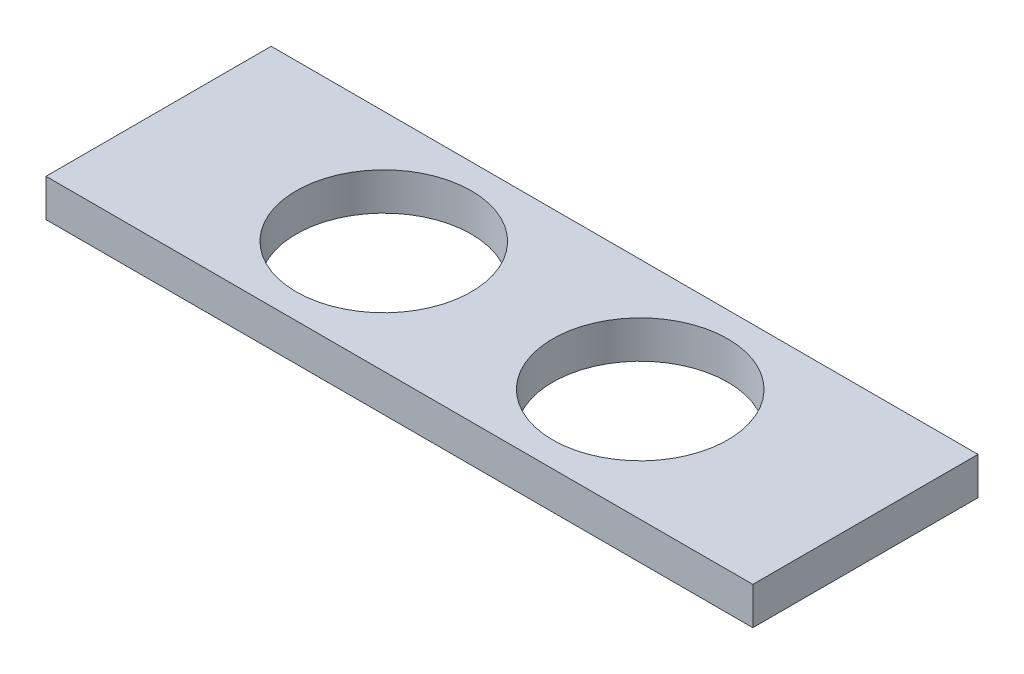
ISO-10303-21;
HEADER;
FILE_DESCRIPTION(('STEP AP214'),'2;1');
FILE_NAME('part.step','',(''),(''),'','','');
FILE_SCHEMA(('AUTOMOTIVE_DESIGN { 1 0 10303 214 1 1 1 1 }'));
ENDSEC;
DATA;
#1=APPLICATION_CONTEXT('core data for automotive mechanical design processes');
#2=APPLICATION_PROTOCOL_DEFINITION('international standard','automotive_design',2000,#1);
#3=PRODUCT_CONTEXT('',#1,'mechanical');
#4=PRODUCT('Part','Part','',(#3));
#5=PRODUCT_RELATED_PRODUCT_CATEGORY('part','',(#4));
#6=PRODUCT_DEFINITION_FORMATION('','',#4);
#7=PRODUCT_DEFINITION_CONTEXT('part definition',#1,'design');
#8=PRODUCT_DEFINITION('design','',#6,#7);
#9=PRODUCT_DEFINITION_SHAPE('','',#8);
#10=(LENGTH_UNIT() NAMED_UNIT(*) SI_UNIT(.MILLI.,.METRE.));
#11=(NAMED_UNIT(*) PLANE_ANGLE_UNIT() SI_UNIT($,.RADIAN.));
#12=(NAMED_UNIT(*) SI_UNIT($,.STERADIAN.) SOLID_ANGLE_UNIT());
#13=UNCERTAINTY_MEASURE_WITH_UNIT(LENGTH_MEASURE(1.E-05),#10,'distance_accuracy_value','');
#14=(GEOMETRIC_REPRESENTATION_CONTEXT(3) GLOBAL_UNCERTAINTY_ASSIGNED_CONTEXT((#13)) GLOBAL_UNIT_ASSIGNED_CONTEXT((#10,
#11,#12)) REPRESENTATION_CONTEXT('',''));
#15=CARTESIAN_POINT('',(0.,0.,0.));
#16=DIRECTION('',(0.,0.,1.));
#17=DIRECTION('',(1.,0.,0.));
#18=AXIS2_PLACEMENT_3D('',#15,#16,#17);
#19=CARTESIAN_POINT('',(0.,3.,0.));
#20=DIRECTION('',(0.,-1.,0.));
#21=DIRECTION('',(0.,0.,-1.));
#22=AXIS2_PLACEMENT_3D('',#19,#20,#21);
#23=PLANE('',#22);
#24=DIRECTION('',(1.,0.,0.));
#25=VECTOR('',#24,1.);
#26=CARTESIAN_POINT('',(-30.5,3.,9.));
#27=LINE('',#26,#25);
#28=CARTESIAN_POINT('',(-30.5,3.,9.));
#29=VERTEX_POINT('',#28);
#30=CARTESIAN_POINT('',(26.,3.,8.99999999999999));
#31=VERTEX_POINT('',#30);
#32=EDGE_CURVE('E103',#29,#31,#27,.T.);
#33=ORIENTED_EDGE('',*,*,#32,.T.);
#34=DIRECTION('',(0.,0.,1.));
#35=VECTOR('',#34,1.);
#36=CARTESIAN_POINT('',(26.,3.,-8.99999999999999));
#37=LINE('',#36,#35);
#38=CARTESIAN_POINT('',(26.,3.,-8.99999999999999));
#39=VERTEX_POINT('',#38);
#40=EDGE_CURVE('E110',#39,#31,#37,.T.);
#41=ORIENTED_EDGE('',*,*,#40,.F.);
#42=DIRECTION('',(1.,0.,0.));
#43=VECTOR('',#42,1.);
#44=CARTESIAN_POINT('',(-30.5,3.,-9.));
#45=LINE('',#44,#43);
#46=CARTESIAN_POINT('',(-30.5,3.,-9.));
#47=VERTEX_POINT('',#46);
#48=EDGE_CURVE('E118',#47,#39,#45,.T.);
#49=ORIENTED_EDGE('',*,*,#48,.F.);
#50=DIRECTION('',(0.,0.,1.));
#51=VECTOR('',#50,1.);
#52=CARTESIAN_POINT('',(-30.5,3.,-9.));
#53=LINE('',#52,#51);
#54=EDGE_CURVE('E80',#47,#29,#53,.T.);
#55=ORIENTED_EDGE('',*,*,#54,.T.);
#56=EDGE_LOOP('',(#33,#41,#49,#55));
#57=FACE_BOUND('',#56,.T.);
#58=CARTESIAN_POINT('',(8.,3.,0.));
#59=DIRECTION('',(0.,1.,0.));
#60=DIRECTION('',(0.,0.,1.));
#61=AXIS2_PLACEMENT_3D('',#58,#59,#60);
#62=CIRCLE('',#61,7.);
#63=CARTESIAN_POINT('',(8.,3.,7.));
#64=VERTEX_POINT('',#63);
#65=EDGE_CURVE('E129',#64,#64,#62,.T.);
#66=ORIENTED_EDGE('',*,*,#65,.F.);
#67=EDGE_LOOP('',(#66));
#68=FACE_BOUND('',#67,.T.);
#69=CARTESIAN_POINT('',(-12.5,3.,0.));
#70=DIRECTION('',(0.,1.,0.));
#71=DIRECTION('',(0.,0.,1.));
#72=AXIS2_PLACEMENT_3D('',#69,#70,#71);
#73=CIRCLE('',#72,7.);
#74=CARTESIAN_POINT('',(-12.5,3.,7.));
#75=VERTEX_POINT('',#74);
#76=EDGE_CURVE('E147',#75,#75,#73,.T.);
#77=ORIENTED_EDGE('',*,*,#76,.F.);
#78=EDGE_LOOP('',(#77));
#79=FACE_BOUND('',#78,.T.);
#80=ADVANCED_FACE('F63',(#57,#68,#79),#23,.F.);
#81=CARTESIAN_POINT('',(0.,0.,0.));
#82=DIRECTION('',(0.,-1.,0.));
#83=DIRECTION('',(0.,0.,-1.));
#84=AXIS2_PLACEMENT_3D('',#81,#82,#83);
#85=PLANE('',#84);
#86=CARTESIAN_POINT('',(8.,0.,0.));
#87=DIRECTION('',(0.,1.,0.));
#88=DIRECTION('',(0.,0.,1.));
#89=AXIS2_PLACEMENT_3D('',#86,#87,#88);
#90=CIRCLE('',#89,7.);
#91=CARTESIAN_POINT('',(8.,0.,7.));
#92=VERTEX_POINT('',#91);
#93=EDGE_CURVE('E150',#92,#92,#90,.T.);
#94=ORIENTED_EDGE('',*,*,#93,.T.);
#95=EDGE_LOOP('',(#94));
#96=FACE_BOUND('',#95,.T.);
#97=DIRECTION('',(1.,0.,0.));
#98=VECTOR('',#97,1.);
#99=CARTESIAN_POINT('',(-30.5,0.,9.));
#100=LINE('',#99,#98);
#101=CARTESIAN_POINT('',(-30.5,0.,9.));
#102=VERTEX_POINT('',#101);
#103=CARTESIAN_POINT('',(26.,0.,8.99999999999999));
#104=VERTEX_POINT('',#103);
#105=EDGE_CURVE('E126',#102,#104,#100,.T.);
#106=ORIENTED_EDGE('',*,*,#105,.F.);
#107=DIRECTION('',(0.,0.,1.));
#108=VECTOR('',#107,1.);
#109=CARTESIAN_POINT('',(-30.5,0.,-9.));
#110=LINE('',#109,#108);
#111=CARTESIAN_POINT('',(-30.5,0.,-9.));
#112=VERTEX_POINT('',#111);
#113=EDGE_CURVE('E98',#112,#102,#110,.T.);
#114=ORIENTED_EDGE('',*,*,#113,.F.);
#115=DIRECTION('',(1.,0.,0.));
#116=VECTOR('',#115,1.);
#117=CARTESIAN_POINT('',(-30.5,0.,-9.));
#118=LINE('',#117,#116);
#119=CARTESIAN_POINT('',(26.,0.,-8.99999999999999));
#120=VERTEX_POINT('',#119);
#121=EDGE_CURVE('E131',#112,#120,#118,.T.);
#122=ORIENTED_EDGE('',*,*,#121,.T.);
#123=DIRECTION('',(0.,0.,1.));
#124=VECTOR('',#123,1.);
#125=CARTESIAN_POINT('',(26.,0.,-8.99999999999999));
#126=LINE('',#125,#124);
#127=EDGE_CURVE('E112',#120,#104,#126,.T.);
#128=ORIENTED_EDGE('',*,*,#127,.T.);
#129=EDGE_LOOP('',(#106,#114,#122,#128));
#130=FACE_BOUND('',#129,.T.);
#131=CARTESIAN_POINT('',(-12.5,0.,0.));
#132=DIRECTION('',(0.,1.,0.));
#133=DIRECTION('',(0.,0.,1.));
#134=AXIS2_PLACEMENT_3D('',#131,#132,#133);
#135=CIRCLE('',#134,7.);
#136=CARTESIAN_POINT('',(-12.5,0.,7.));
#137=VERTEX_POINT('',#136);
#138=EDGE_CURVE('E145',#137,#137,#135,.T.);
#139=ORIENTED_EDGE('',*,*,#138,.T.);
#140=EDGE_LOOP('',(#139));
#141=FACE_BOUND('',#140,.T.);
#142=ADVANCED_FACE('F138',(#96,#130,#141),#85,.T.);
#143=CARTESIAN_POINT('',(-30.5,3.,9.));
#144=DIRECTION('',(0.,0.,-1.));
#145=DIRECTION('',(-1.,0.,0.));
#146=AXIS2_PLACEMENT_3D('',#143,#144,#145);
#147=PLANE('',#146);
#148=ORIENTED_EDGE('',*,*,#105,.T.);
#149=DIRECTION('',(0.,-1.,0.));
#150=VECTOR('',#149,1.);
#151=CARTESIAN_POINT('',(26.,3.,8.99999999999999));
#152=LINE('',#151,#150);
#153=EDGE_CURVE('E12',#31,#104,#152,.T.);
#154=ORIENTED_EDGE('',*,*,#153,.F.);
#155=ORIENTED_EDGE('',*,*,#32,.F.);
#156=DIRECTION('',(0.,-1.,0.));
#157=VECTOR('',#156,1.);
#158=CARTESIAN_POINT('',(-30.5,3.,9.));
#159=LINE('',#158,#157);
#160=EDGE_CURVE('E122',#29,#102,#159,.T.);
#161=ORIENTED_EDGE('',*,*,#160,.T.);
#162=EDGE_LOOP('',(#148,#154,#155,#161));
#163=FACE_BOUND('',#162,.T.);
#164=ADVANCED_FACE('F65',(#163),#147,.F.);
#165=CARTESIAN_POINT('',(26.,3.,-8.99999999999999));
#166=DIRECTION('',(1.,0.,0.));
#167=DIRECTION('',(0.,0.,-1.));
#168=AXIS2_PLACEMENT_3D('',#165,#166,#167);
#169=PLANE('',#168);
#170=ORIENTED_EDGE('',*,*,#127,.F.);
#171=DIRECTION('',(0.,-1.,0.));
#172=VECTOR('',#171,1.);
#173=CARTESIAN_POINT('',(26.,3.,-8.99999999999999));
#174=LINE('',#173,#172);
#175=EDGE_CURVE('E72',#39,#120,#174,.T.);
#176=ORIENTED_EDGE('',*,*,#175,.F.);
#177=ORIENTED_EDGE('',*,*,#40,.T.);
#178=ORIENTED_EDGE('',*,*,#153,.T.);
#179=EDGE_LOOP('',(#170,#176,#177,#178));
#180=FACE_BOUND('',#179,.T.);
#181=ADVANCED_FACE('F109',(#180),#169,.T.);
#182=CARTESIAN_POINT('',(-30.5,3.,-9.));
#183=DIRECTION('',(0.,0.,-1.));
#184=DIRECTION('',(-1.,0.,0.));
#185=AXIS2_PLACEMENT_3D('',#182,#183,#184);
#186=PLANE('',#185);
#187=ORIENTED_EDGE('',*,*,#121,.F.);
#188=DIRECTION('',(0.,-1.,0.));
#189=VECTOR('',#188,1.);
#190=CARTESIAN_POINT('',(-30.5,3.,-9.));
#191=LINE('',#190,#189);
#192=EDGE_CURVE('E95',#47,#112,#191,.T.);
#193=ORIENTED_EDGE('',*,*,#192,.F.);
#194=ORIENTED_EDGE('',*,*,#48,.T.);
#195=ORIENTED_EDGE('',*,*,#175,.T.);
#196=EDGE_LOOP('',(#187,#193,#194,#195));
#197=FACE_BOUND('',#196,.T.);
#198=ADVANCED_FACE('F120',(#197),#186,.T.);
#199=CARTESIAN_POINT('',(-30.5,3.,-9.));
#200=DIRECTION('',(1.,0.,0.));
#201=DIRECTION('',(0.,0.,-1.));
#202=AXIS2_PLACEMENT_3D('',#199,#200,#201);
#203=PLANE('',#202);
#204=ORIENTED_EDGE('',*,*,#113,.T.);
#205=ORIENTED_EDGE('',*,*,#160,.F.);
#206=ORIENTED_EDGE('',*,*,#54,.F.);
#207=ORIENTED_EDGE('',*,*,#192,.T.);
#208=EDGE_LOOP('',(#204,#205,#206,#207));
#209=FACE_BOUND('',#208,.T.);
#210=ADVANCED_FACE('F161',(#209),#203,.F.);
#211=CARTESIAN_POINT('',(8.,3.,0.));
#212=DIRECTION('',(0.,-1.,0.));
#213=DIRECTION('',(0.,0.,-1.));
#214=AXIS2_PLACEMENT_3D('',#211,#212,#213);
#215=CYLINDRICAL_SURFACE('',#214,7.);
#216=ORIENTED_EDGE('',*,*,#65,.T.);
#217=EDGE_LOOP('',(#216));
#218=FACE_BOUND('',#217,.T.);
#219=ORIENTED_EDGE('',*,*,#93,.F.);
#220=EDGE_LOOP('',(#219));
#221=FACE_BOUND('',#220,.T.);
#222=ADVANCED_FACE('F158',(#218,#221),#215,.F.);
#223=CARTESIAN_POINT('',(-12.5,3.,0.));
#224=DIRECTION('',(0.,-1.,0.));
#225=DIRECTION('',(0.,0.,-1.));
#226=AXIS2_PLACEMENT_3D('',#223,#224,#225);
#227=CYLINDRICAL_SURFACE('',#226,7.);
#228=ORIENTED_EDGE('',*,*,#76,.T.);
#229=EDGE_LOOP('',(#228));
#230=FACE_BOUND('',#229,.T.);
#231=ORIENTED_EDGE('',*,*,#138,.F.);
#232=EDGE_LOOP('',(#231));
#233=FACE_BOUND('',#232,.T.);
#234=ADVANCED_FACE('F160',(#230,#233),#227,.F.);
#235=CLOSED_SHELL('',(#80,#142,#164,#181,#198,#210,#222,#234));
#236=MANIFOLD_SOLID_BREP('B2',#235);
#237=ADVANCED_BREP_SHAPE_REPRESENTATION('',(#18,#236),#14);
#238=SHAPE_DEFINITION_REPRESENTATION(#9,#237);
ENDSEC;
END-ISO-10303-21;
